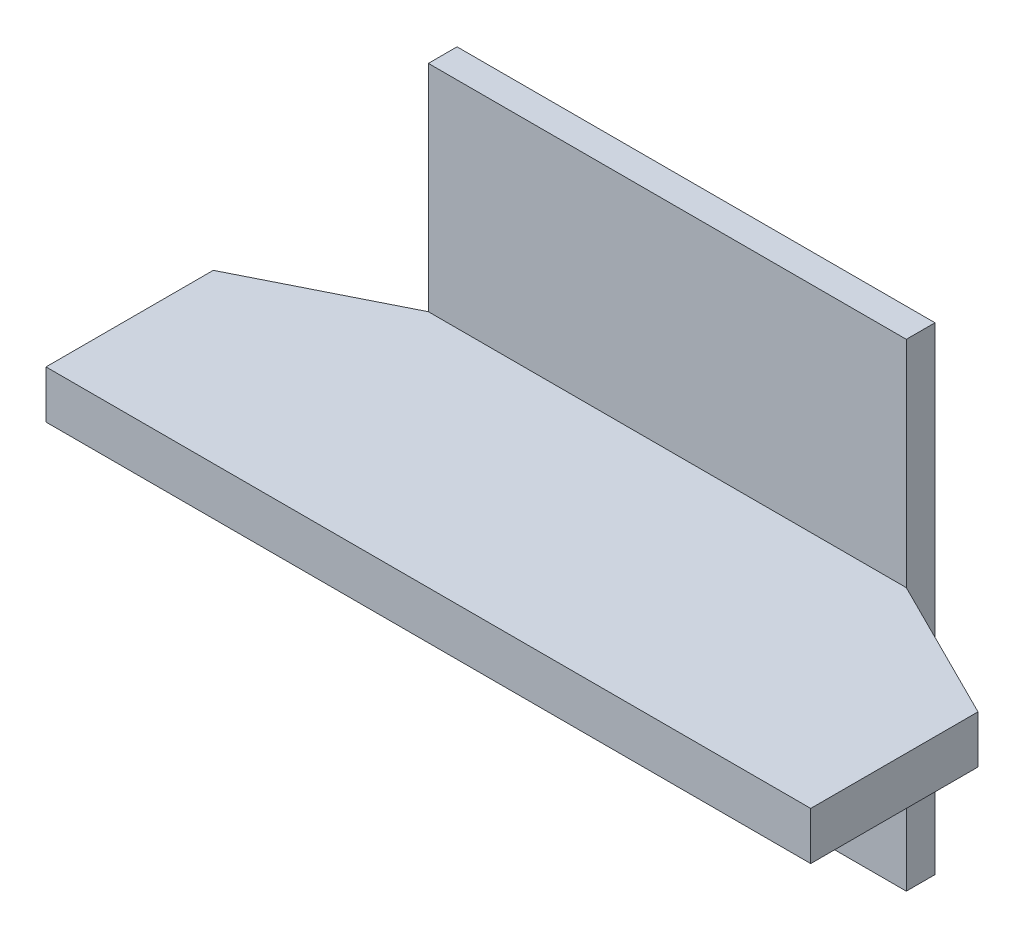
ISO-10303-21;
HEADER;
FILE_DESCRIPTION(('STEP AP214'),'2;1');
FILE_NAME('part.step','',(''),(''),'','','');
FILE_SCHEMA(('AUTOMOTIVE_DESIGN { 1 0 10303 214 1 1 1 1 }'));
ENDSEC;
DATA;
#1=APPLICATION_CONTEXT('core data for automotive mechanical design processes');
#2=APPLICATION_PROTOCOL_DEFINITION('international standard','automotive_design',2000,#1);
#3=PRODUCT_CONTEXT('',#1,'mechanical');
#4=PRODUCT('Part','Part','',(#3));
#5=PRODUCT_RELATED_PRODUCT_CATEGORY('part','',(#4));
#6=PRODUCT_DEFINITION_FORMATION('','',#4);
#7=PRODUCT_DEFINITION_CONTEXT('part definition',#1,'design');
#8=PRODUCT_DEFINITION('design','',#6,#7);
#9=PRODUCT_DEFINITION_SHAPE('','',#8);
#10=(LENGTH_UNIT() NAMED_UNIT(*) SI_UNIT(.MILLI.,.METRE.));
#11=(NAMED_UNIT(*) PLANE_ANGLE_UNIT() SI_UNIT($,.RADIAN.));
#12=(NAMED_UNIT(*) SI_UNIT($,.STERADIAN.) SOLID_ANGLE_UNIT());
#13=UNCERTAINTY_MEASURE_WITH_UNIT(LENGTH_MEASURE(1.E-05),#10,'distance_accuracy_value','');
#14=(GEOMETRIC_REPRESENTATION_CONTEXT(3) GLOBAL_UNCERTAINTY_ASSIGNED_CONTEXT((#13)) GLOBAL_UNIT_ASSIGNED_CONTEXT((#10,
#11,#12)) REPRESENTATION_CONTEXT('',''));
#15=CARTESIAN_POINT('',(0.,0.,0.));
#16=DIRECTION('',(0.,0.,1.));
#17=DIRECTION('',(1.,0.,0.));
#18=AXIS2_PLACEMENT_3D('',#15,#16,#17);
#19=CARTESIAN_POINT('',(0.,200.,12.));
#20=DIRECTION('',(0.,0.,-1.));
#21=DIRECTION('',(-1.,0.,0.));
#22=AXIS2_PLACEMENT_3D('',#19,#20,#21);
#23=PLANE('',#22);
#24=DIRECTION('',(-1.,0.,0.));
#25=VECTOR('',#24,1.);
#26=CARTESIAN_POINT('',(-60.,110.,12.));
#27=LINE('',#26,#25);
#28=CARTESIAN_POINT('',(200.,110.,12.));
#29=VERTEX_POINT('',#28);
#30=CARTESIAN_POINT('',(0.,110.,12.));
#31=VERTEX_POINT('',#30);
#32=EDGE_CURVE('E133',#29,#31,#27,.T.);
#33=ORIENTED_EDGE('',*,*,#32,.F.);
#34=DIRECTION('',(0.,1.,0.));
#35=VECTOR('',#34,1.);
#36=CARTESIAN_POINT('',(200.,0.,12.));
#37=LINE('',#36,#35);
#38=CARTESIAN_POINT('',(200.,200.,12.));
#39=VERTEX_POINT('',#38);
#40=EDGE_CURVE('E148',#29,#39,#37,.T.);
#41=ORIENTED_EDGE('',*,*,#40,.T.);
#42=DIRECTION('',(-1.,0.,0.));
#43=VECTOR('',#42,1.);
#44=CARTESIAN_POINT('',(0.,200.,12.));
#45=LINE('',#44,#43);
#46=CARTESIAN_POINT('',(0.,200.,12.));
#47=VERTEX_POINT('',#46);
#48=EDGE_CURVE('E152',#39,#47,#45,.T.);
#49=ORIENTED_EDGE('',*,*,#48,.T.);
#50=DIRECTION('',(0.,-1.,0.));
#51=VECTOR('',#50,1.);
#52=CARTESIAN_POINT('',(0.,0.,12.));
#53=LINE('',#52,#51);
#54=EDGE_CURVE('E114',#47,#31,#53,.T.);
#55=ORIENTED_EDGE('',*,*,#54,.T.);
#56=EDGE_LOOP('',(#33,#41,#49,#55));
#57=FACE_BOUND('',#56,.T.);
#58=ADVANCED_FACE('F32',(#57),#23,.F.);
#59=DIRECTION('',(1.,0.,0.));
#60=VECTOR('',#59,1.);
#61=CARTESIAN_POINT('',(-60.,90.,12.));
#62=LINE('',#61,#60);
#63=CARTESIAN_POINT('',(0.,90.,12.));
#64=VERTEX_POINT('',#63);
#65=CARTESIAN_POINT('',(200.,90.,12.));
#66=VERTEX_POINT('',#65);
#67=EDGE_CURVE('E123',#64,#66,#62,.T.);
#68=ORIENTED_EDGE('',*,*,#67,.F.);
#69=CARTESIAN_POINT('',(0.,0.,12.));
#70=VERTEX_POINT('',#69);
#71=EDGE_CURVE('E115',#64,#70,#53,.T.);
#72=ORIENTED_EDGE('',*,*,#71,.T.);
#73=DIRECTION('',(1.,0.,0.));
#74=VECTOR('',#73,1.);
#75=CARTESIAN_POINT('',(0.,0.,12.));
#76=LINE('',#75,#74);
#77=CARTESIAN_POINT('',(200.,0.,12.));
#78=VERTEX_POINT('',#77);
#79=EDGE_CURVE('E144',#70,#78,#76,.T.);
#80=ORIENTED_EDGE('',*,*,#79,.T.);
#81=EDGE_CURVE('E132',#78,#66,#37,.T.);
#82=ORIENTED_EDGE('',*,*,#81,.T.);
#83=EDGE_LOOP('',(#68,#72,#80,#82));
#84=FACE_BOUND('',#83,.T.);
#85=ADVANCED_FACE('F129',(#84),#23,.F.);
#86=CARTESIAN_POINT('',(0.,0.,12.));
#87=DIRECTION('',(1.,0.,0.));
#88=DIRECTION('',(0.,0.,-1.));
#89=AXIS2_PLACEMENT_3D('',#86,#87,#88);
#90=PLANE('',#89);
#91=DIRECTION('',(0.,-1.,0.));
#92=VECTOR('',#91,1.);
#93=CARTESIAN_POINT('',(0.,0.,0.));
#94=LINE('',#93,#92);
#95=CARTESIAN_POINT('',(0.,200.,0.));
#96=VERTEX_POINT('',#95);
#97=CARTESIAN_POINT('',(0.,0.,0.));
#98=VERTEX_POINT('',#97);
#99=EDGE_CURVE('E155',#96,#98,#94,.T.);
#100=ORIENTED_EDGE('',*,*,#99,.T.);
#101=DIRECTION('',(0.,0.,-1.));
#102=VECTOR('',#101,1.);
#103=CARTESIAN_POINT('',(0.,0.,12.));
#104=LINE('',#103,#102);
#105=EDGE_CURVE('E134',#70,#98,#104,.T.);
#106=ORIENTED_EDGE('',*,*,#105,.F.);
#107=ORIENTED_EDGE('',*,*,#71,.F.);
#108=EDGE_CURVE('E106',#31,#64,#53,.T.);
#109=ORIENTED_EDGE('',*,*,#108,.F.);
#110=ORIENTED_EDGE('',*,*,#54,.F.);
#111=DIRECTION('',(0.,0.,-1.));
#112=VECTOR('',#111,1.);
#113=CARTESIAN_POINT('',(0.,200.,12.));
#114=LINE('',#113,#112);
#115=EDGE_CURVE('E154',#47,#96,#114,.T.);
#116=ORIENTED_EDGE('',*,*,#115,.T.);
#117=EDGE_LOOP('',(#100,#106,#107,#109,#110,#116));
#118=FACE_BOUND('',#117,.T.);
#119=ADVANCED_FACE('F34',(#118),#90,.F.);
#120=CARTESIAN_POINT('',(0.,0.,12.));
#121=DIRECTION('',(0.,1.,0.));
#122=DIRECTION('',(0.,0.,1.));
#123=AXIS2_PLACEMENT_3D('',#120,#121,#122);
#124=PLANE('',#123);
#125=DIRECTION('',(1.,0.,0.));
#126=VECTOR('',#125,1.);
#127=CARTESIAN_POINT('',(0.,0.,0.));
#128=LINE('',#127,#126);
#129=CARTESIAN_POINT('',(200.,0.,0.));
#130=VERTEX_POINT('',#129);
#131=EDGE_CURVE('E157',#98,#130,#128,.T.);
#132=ORIENTED_EDGE('',*,*,#131,.T.);
#133=DIRECTION('',(0.,0.,-1.));
#134=VECTOR('',#133,1.);
#135=CARTESIAN_POINT('',(200.,0.,12.));
#136=LINE('',#135,#134);
#137=EDGE_CURVE('E165',#78,#130,#136,.T.);
#138=ORIENTED_EDGE('',*,*,#137,.F.);
#139=ORIENTED_EDGE('',*,*,#79,.F.);
#140=ORIENTED_EDGE('',*,*,#105,.T.);
#141=EDGE_LOOP('',(#132,#138,#139,#140));
#142=FACE_BOUND('',#141,.T.);
#143=ADVANCED_FACE('F229',(#142),#124,.F.);
#144=CARTESIAN_POINT('',(200.,0.,12.));
#145=DIRECTION('',(-1.,0.,0.));
#146=DIRECTION('',(0.,0.,1.));
#147=AXIS2_PLACEMENT_3D('',#144,#145,#146);
#148=PLANE('',#147);
#149=DIRECTION('',(0.,1.,0.));
#150=VECTOR('',#149,1.);
#151=CARTESIAN_POINT('',(200.,0.,0.));
#152=LINE('',#151,#150);
#153=CARTESIAN_POINT('',(200.,200.,0.));
#154=VERTEX_POINT('',#153);
#155=EDGE_CURVE('E140',#130,#154,#152,.T.);
#156=ORIENTED_EDGE('',*,*,#155,.T.);
#157=DIRECTION('',(0.,0.,-1.));
#158=VECTOR('',#157,1.);
#159=CARTESIAN_POINT('',(200.,200.,12.));
#160=LINE('',#159,#158);
#161=EDGE_CURVE('E162',#39,#154,#160,.T.);
#162=ORIENTED_EDGE('',*,*,#161,.F.);
#163=ORIENTED_EDGE('',*,*,#40,.F.);
#164=EDGE_CURVE('E54',#66,#29,#37,.T.);
#165=ORIENTED_EDGE('',*,*,#164,.F.);
#166=ORIENTED_EDGE('',*,*,#81,.F.);
#167=ORIENTED_EDGE('',*,*,#137,.T.);
#168=EDGE_LOOP('',(#156,#162,#163,#165,#166,#167));
#169=FACE_BOUND('',#168,.T.);
#170=ADVANCED_FACE('F226',(#169),#148,.F.);
#171=CARTESIAN_POINT('',(0.,200.,12.));
#172=DIRECTION('',(0.,-1.,0.));
#173=DIRECTION('',(0.,0.,-1.));
#174=AXIS2_PLACEMENT_3D('',#171,#172,#173);
#175=PLANE('',#174);
#176=DIRECTION('',(-1.,0.,0.));
#177=VECTOR('',#176,1.);
#178=CARTESIAN_POINT('',(0.,200.,0.));
#179=LINE('',#178,#177);
#180=EDGE_CURVE('E139',#154,#96,#179,.T.);
#181=ORIENTED_EDGE('',*,*,#180,.T.);
#182=ORIENTED_EDGE('',*,*,#115,.F.);
#183=ORIENTED_EDGE('',*,*,#48,.F.);
#184=ORIENTED_EDGE('',*,*,#161,.T.);
#185=EDGE_LOOP('',(#181,#182,#183,#184));
#186=FACE_BOUND('',#185,.T.);
#187=ADVANCED_FACE('F215',(#186),#175,.F.);
#188=CARTESIAN_POINT('',(0.,200.,0.));
#189=DIRECTION('',(0.,0.,-1.));
#190=DIRECTION('',(-1.,0.,0.));
#191=AXIS2_PLACEMENT_3D('',#188,#189,#190);
#192=PLANE('',#191);
#193=ORIENTED_EDGE('',*,*,#99,.F.);
#194=ORIENTED_EDGE('',*,*,#180,.F.);
#195=ORIENTED_EDGE('',*,*,#155,.F.);
#196=ORIENTED_EDGE('',*,*,#131,.F.);
#197=EDGE_LOOP('',(#193,#194,#195,#196));
#198=FACE_BOUND('',#197,.T.);
#199=ADVANCED_FACE('F208',(#198),#192,.T.);
#200=CARTESIAN_POINT('',(-60.,110.,112.));
#201=DIRECTION('',(1.,0.,0.));
#202=DIRECTION('',(0.,0.,-1.));
#203=AXIS2_PLACEMENT_3D('',#200,#201,#202);
#204=PLANE('',#203);
#205=DIRECTION('',(0.,0.,-1.));
#206=VECTOR('',#205,1.);
#207=CARTESIAN_POINT('',(-60.,110.,112.));
#208=LINE('',#207,#206);
#209=CARTESIAN_POINT('',(-60.,110.,112.));
#210=VERTEX_POINT('',#209);
#211=CARTESIAN_POINT('',(-60.,110.,42.));
#212=VERTEX_POINT('',#211);
#213=EDGE_CURVE('E173',#210,#212,#208,.T.);
#214=ORIENTED_EDGE('',*,*,#213,.T.);
#215=DIRECTION('',(0.,-1.,0.));
#216=VECTOR('',#215,1.);
#217=CARTESIAN_POINT('',(-60.,200.,42.));
#218=LINE('',#217,#216);
#219=CARTESIAN_POINT('',(-60.,90.,42.));
#220=VERTEX_POINT('',#219);
#221=EDGE_CURVE('E47',#212,#220,#218,.T.);
#222=ORIENTED_EDGE('',*,*,#221,.T.);
#223=DIRECTION('',(0.,0.,-1.));
#224=VECTOR('',#223,1.);
#225=CARTESIAN_POINT('',(-60.,90.,112.));
#226=LINE('',#225,#224);
#227=CARTESIAN_POINT('',(-60.,90.,112.));
#228=VERTEX_POINT('',#227);
#229=EDGE_CURVE('E125',#228,#220,#226,.T.);
#230=ORIENTED_EDGE('',*,*,#229,.F.);
#231=DIRECTION('',(0.,-1.,0.));
#232=VECTOR('',#231,1.);
#233=CARTESIAN_POINT('',(-60.,110.,112.));
#234=LINE('',#233,#232);
#235=EDGE_CURVE('E193',#210,#228,#234,.T.);
#236=ORIENTED_EDGE('',*,*,#235,.F.);
#237=EDGE_LOOP('',(#214,#222,#230,#236));
#238=FACE_BOUND('',#237,.T.);
#239=ADVANCED_FACE('F206',(#238),#204,.F.);
#240=CARTESIAN_POINT('',(-60.,90.,112.));
#241=DIRECTION('',(0.,1.,0.));
#242=DIRECTION('',(0.,0.,1.));
#243=AXIS2_PLACEMENT_3D('',#240,#241,#242);
#244=PLANE('',#243);
#245=ORIENTED_EDGE('',*,*,#229,.T.);
#246=DIRECTION('',(-0.894427190999916,0.,0.447213595499958));
#247=VECTOR('',#246,1.);
#248=CARTESIAN_POINT('',(-60.,90.,42.));
#249=LINE('',#248,#247);
#250=EDGE_CURVE('E109',#64,#220,#249,.T.);
#251=ORIENTED_EDGE('',*,*,#250,.F.);
#252=ORIENTED_EDGE('',*,*,#67,.T.);
#253=DIRECTION('',(-0.894427190999916,0.,-0.447213595499958));
#254=VECTOR('',#253,1.);
#255=CARTESIAN_POINT('',(200.,90.,12.));
#256=LINE('',#255,#254);
#257=CARTESIAN_POINT('',(260.,90.,42.));
#258=VERTEX_POINT('',#257);
#259=EDGE_CURVE('E191',#258,#66,#256,.T.);
#260=ORIENTED_EDGE('',*,*,#259,.F.);
#261=DIRECTION('',(0.,0.,-1.));
#262=VECTOR('',#261,1.);
#263=CARTESIAN_POINT('',(260.,90.,112.));
#264=LINE('',#263,#262);
#265=CARTESIAN_POINT('',(260.,90.,112.));
#266=VERTEX_POINT('',#265);
#267=EDGE_CURVE('E179',#266,#258,#264,.T.);
#268=ORIENTED_EDGE('',*,*,#267,.F.);
#269=DIRECTION('',(1.,0.,0.));
#270=VECTOR('',#269,1.);
#271=CARTESIAN_POINT('',(-60.,90.,112.));
#272=LINE('',#271,#270);
#273=EDGE_CURVE('E189',#228,#266,#272,.T.);
#274=ORIENTED_EDGE('',*,*,#273,.F.);
#275=EDGE_LOOP('',(#245,#251,#252,#260,#268,#274));
#276=FACE_BOUND('',#275,.T.);
#277=ADVANCED_FACE('F121',(#276),#244,.F.);
#278=CARTESIAN_POINT('',(260.,110.,112.));
#279=DIRECTION('',(-1.,0.,0.));
#280=DIRECTION('',(0.,0.,1.));
#281=AXIS2_PLACEMENT_3D('',#278,#279,#280);
#282=PLANE('',#281);
#283=ORIENTED_EDGE('',*,*,#267,.T.);
#284=DIRECTION('',(0.,-1.,0.));
#285=VECTOR('',#284,1.);
#286=CARTESIAN_POINT('',(260.,200.,42.));
#287=LINE('',#286,#285);
#288=CARTESIAN_POINT('',(260.,110.,42.));
#289=VERTEX_POINT('',#288);
#290=EDGE_CURVE('E187',#289,#258,#287,.T.);
#291=ORIENTED_EDGE('',*,*,#290,.F.);
#292=DIRECTION('',(0.,0.,-1.));
#293=VECTOR('',#292,1.);
#294=CARTESIAN_POINT('',(260.,110.,112.));
#295=LINE('',#294,#293);
#296=CARTESIAN_POINT('',(260.,110.,112.));
#297=VERTEX_POINT('',#296);
#298=EDGE_CURVE('E176',#297,#289,#295,.T.);
#299=ORIENTED_EDGE('',*,*,#298,.F.);
#300=DIRECTION('',(0.,1.,0.));
#301=VECTOR('',#300,1.);
#302=CARTESIAN_POINT('',(260.,110.,112.));
#303=LINE('',#302,#301);
#304=EDGE_CURVE('E188',#266,#297,#303,.T.);
#305=ORIENTED_EDGE('',*,*,#304,.F.);
#306=EDGE_LOOP('',(#283,#291,#299,#305));
#307=FACE_BOUND('',#306,.T.);
#308=ADVANCED_FACE('F185',(#307),#282,.F.);
#309=CARTESIAN_POINT('',(-60.,110.,112.));
#310=DIRECTION('',(0.,-1.,0.));
#311=DIRECTION('',(0.,0.,-1.));
#312=AXIS2_PLACEMENT_3D('',#309,#310,#311);
#313=PLANE('',#312);
#314=ORIENTED_EDGE('',*,*,#32,.T.);
#315=DIRECTION('',(-0.894427190999916,0.,0.447213595499958));
#316=VECTOR('',#315,1.);
#317=CARTESIAN_POINT('',(-88.,110.,56.));
#318=LINE('',#317,#316);
#319=EDGE_CURVE('E11',#31,#212,#318,.T.);
#320=ORIENTED_EDGE('',*,*,#319,.T.);
#321=ORIENTED_EDGE('',*,*,#213,.F.);
#322=DIRECTION('',(-1.,0.,0.));
#323=VECTOR('',#322,1.);
#324=CARTESIAN_POINT('',(-60.,110.,112.));
#325=LINE('',#324,#323);
#326=EDGE_CURVE('E177',#297,#210,#325,.T.);
#327=ORIENTED_EDGE('',*,*,#326,.F.);
#328=ORIENTED_EDGE('',*,*,#298,.T.);
#329=DIRECTION('',(-0.894427190999916,0.,-0.447213595499958));
#330=VECTOR('',#329,1.);
#331=CARTESIAN_POINT('',(31.9999999999999,110.,-72.));
#332=LINE('',#331,#330);
#333=EDGE_CURVE('E40',#289,#29,#332,.T.);
#334=ORIENTED_EDGE('',*,*,#333,.T.);
#335=EDGE_LOOP('',(#314,#320,#321,#327,#328,#334));
#336=FACE_BOUND('',#335,.T.);
#337=ADVANCED_FACE('F204',(#336),#313,.F.);
#338=CARTESIAN_POINT('',(-60.,90.,112.));
#339=DIRECTION('',(0.,0.,1.));
#340=DIRECTION('',(1.,0.,0.));
#341=AXIS2_PLACEMENT_3D('',#338,#339,#340);
#342=PLANE('',#341);
#343=ORIENTED_EDGE('',*,*,#235,.T.);
#344=ORIENTED_EDGE('',*,*,#273,.T.);
#345=ORIENTED_EDGE('',*,*,#304,.T.);
#346=ORIENTED_EDGE('',*,*,#326,.T.);
#347=EDGE_LOOP('',(#343,#344,#345,#346));
#348=FACE_BOUND('',#347,.T.);
#349=ADVANCED_FACE('F202',(#348),#342,.T.);
#350=CARTESIAN_POINT('',(200.,200.,12.));
#351=DIRECTION('',(-0.447213595499958,0.,0.894427190999916));
#352=DIRECTION('',(0.894427190999916,0.,0.447213595499958));
#353=AXIS2_PLACEMENT_3D('',#350,#351,#352);
#354=PLANE('',#353);
#355=ORIENTED_EDGE('',*,*,#290,.T.);
#356=ORIENTED_EDGE('',*,*,#259,.T.);
#357=ORIENTED_EDGE('',*,*,#164,.T.);
#358=ORIENTED_EDGE('',*,*,#333,.F.);
#359=EDGE_LOOP('',(#355,#356,#357,#358));
#360=FACE_BOUND('',#359,.T.);
#361=ADVANCED_FACE('F265',(#360),#354,.F.);
#362=CARTESIAN_POINT('',(-60.,200.,42.));
#363=DIRECTION('',(0.447213595499958,0.,0.894427190999916));
#364=DIRECTION('',(0.894427190999916,0.,-0.447213595499958));
#365=AXIS2_PLACEMENT_3D('',#362,#363,#364);
#366=PLANE('',#365);
#367=ORIENTED_EDGE('',*,*,#108,.T.);
#368=ORIENTED_EDGE('',*,*,#250,.T.);
#369=ORIENTED_EDGE('',*,*,#221,.F.);
#370=ORIENTED_EDGE('',*,*,#319,.F.);
#371=EDGE_LOOP('',(#367,#368,#369,#370));
#372=FACE_BOUND('',#371,.T.);
#373=ADVANCED_FACE('F108',(#372),#366,.F.);
#374=CLOSED_SHELL('',(#58,#85,#119,#143,#170,#187,#199,#239,#277,#308,#337,#349,#361,#373));
#375=MANIFOLD_SOLID_BREP('B2',#374);
#376=ADVANCED_BREP_SHAPE_REPRESENTATION('',(#18,#375),#14);
#377=SHAPE_DEFINITION_REPRESENTATION(#9,#376);
ENDSEC;
END-ISO-10303-21;
